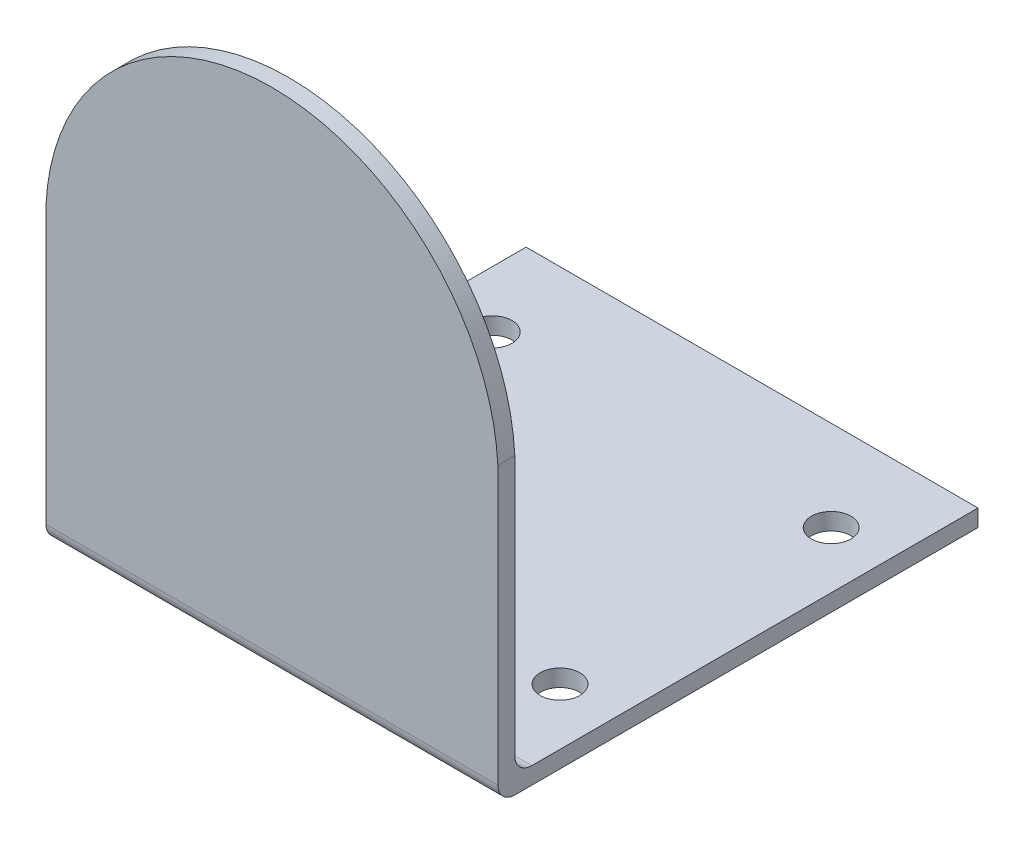
ISO-10303-21;
HEADER;
FILE_DESCRIPTION(('STEP AP214'),'2;1');
FILE_NAME('part.step','',(''),(''),'','','');
FILE_SCHEMA(('AUTOMOTIVE_DESIGN { 1 0 10303 214 1 1 1 1 }'));
ENDSEC;
DATA;
#1=APPLICATION_CONTEXT('core data for automotive mechanical design processes');
#2=APPLICATION_PROTOCOL_DEFINITION('international standard','automotive_design',2000,#1);
#3=PRODUCT_CONTEXT('',#1,'mechanical');
#4=PRODUCT('Part','Part','',(#3));
#5=PRODUCT_RELATED_PRODUCT_CATEGORY('part','',(#4));
#6=PRODUCT_DEFINITION_FORMATION('','',#4);
#7=PRODUCT_DEFINITION_CONTEXT('part definition',#1,'design');
#8=PRODUCT_DEFINITION('design','',#6,#7);
#9=PRODUCT_DEFINITION_SHAPE('','',#8);
#10=(LENGTH_UNIT() NAMED_UNIT(*) SI_UNIT(.MILLI.,.METRE.));
#11=(NAMED_UNIT(*) PLANE_ANGLE_UNIT() SI_UNIT($,.RADIAN.));
#12=(NAMED_UNIT(*) SI_UNIT($,.STERADIAN.) SOLID_ANGLE_UNIT());
#13=UNCERTAINTY_MEASURE_WITH_UNIT(LENGTH_MEASURE(1.E-05),#10,'distance_accuracy_value','');
#14=(GEOMETRIC_REPRESENTATION_CONTEXT(3) GLOBAL_UNCERTAINTY_ASSIGNED_CONTEXT((#13)) GLOBAL_UNIT_ASSIGNED_CONTEXT((#10,
#11,#12)) REPRESENTATION_CONTEXT('',''));
#15=CARTESIAN_POINT('',(0.,0.,0.));
#16=DIRECTION('',(0.,0.,1.));
#17=DIRECTION('',(1.,0.,0.));
#18=AXIS2_PLACEMENT_3D('',#15,#16,#17);
#19=CARTESIAN_POINT('',(0.,1.5,0.));
#20=DIRECTION('',(0.,1.,0.));
#21=DIRECTION('',(0.,0.,1.));
#22=AXIS2_PLACEMENT_3D('',#19,#20,#21);
#23=PLANE('',#22);
#24=CARTESIAN_POINT('',(13.5904436860068,1.5,-9.41126279863477));
#25=DIRECTION('',(0.,1.,0.));
#26=DIRECTION('',(0.,0.,1.));
#27=AXIS2_PLACEMENT_3D('',#24,#25,#26);
#28=CIRCLE('',#27,1.75);
#29=CARTESIAN_POINT('',(13.5904436860068,1.5,-7.66126279863477));
#30=VERTEX_POINT('',#29);
#31=EDGE_CURVE('E139',#30,#30,#28,.T.);
#32=ORIENTED_EDGE('',*,*,#31,.F.);
#33=EDGE_LOOP('',(#32));
#34=FACE_BOUND('',#33,.T.);
#35=CARTESIAN_POINT('',(-16.4095563139932,1.5,-9.41126279863477));
#36=DIRECTION('',(0.,1.,0.));
#37=DIRECTION('',(0.,0.,1.));
#38=AXIS2_PLACEMENT_3D('',#35,#36,#37);
#39=CIRCLE('',#38,1.75);
#40=CARTESIAN_POINT('',(-16.4095563139932,1.5,-7.66126279863477));
#41=VERTEX_POINT('',#40);
#42=EDGE_CURVE('E151',#41,#41,#39,.T.);
#43=ORIENTED_EDGE('',*,*,#42,.F.);
#44=EDGE_LOOP('',(#43));
#45=FACE_BOUND('',#44,.T.);
#46=DIRECTION('',(0.,0.,1.));
#47=VECTOR('',#46,1.);
#48=CARTESIAN_POINT('',(-21.4095563139932,1.5,-17.4112627986348));
#49=LINE('',#48,#47);
#50=CARTESIAN_POINT('',(-21.4095563139932,1.5,-17.4112627986348));
#51=VERTEX_POINT('',#50);
#52=CARTESIAN_POINT('',(-21.4095563139932,1.5,22.0887372013652));
#53=VERTEX_POINT('',#52);
#54=EDGE_CURVE('E157',#51,#53,#49,.T.);
#55=ORIENTED_EDGE('',*,*,#54,.T.);
#56=DIRECTION('',(1.,0.,0.));
#57=VECTOR('',#56,1.);
#58=CARTESIAN_POINT('',(18.5904436860068,1.5,22.0887372013652));
#59=LINE('',#58,#57);
#60=CARTESIAN_POINT('',(18.5904436860068,1.5,22.0887372013652));
#61=VERTEX_POINT('',#60);
#62=EDGE_CURVE('E182',#53,#61,#59,.T.);
#63=ORIENTED_EDGE('',*,*,#62,.T.);
#64=DIRECTION('',(0.,0.,-1.));
#65=VECTOR('',#64,1.);
#66=CARTESIAN_POINT('',(18.5904436860068,1.5,-17.4112627986348));
#67=LINE('',#66,#65);
#68=CARTESIAN_POINT('',(18.5904436860068,1.5,-17.4112627986348));
#69=VERTEX_POINT('',#68);
#70=EDGE_CURVE('E159',#61,#69,#67,.T.);
#71=ORIENTED_EDGE('',*,*,#70,.T.);
#72=DIRECTION('',(-1.,0.,0.));
#73=VECTOR('',#72,1.);
#74=CARTESIAN_POINT('',(-21.4095563139932,1.5,-17.4112627986348));
#75=LINE('',#74,#73);
#76=EDGE_CURVE('E162',#69,#51,#75,.T.);
#77=ORIENTED_EDGE('',*,*,#76,.T.);
#78=EDGE_LOOP('',(#55,#63,#71,#77));
#79=FACE_BOUND('',#78,.T.);
#80=CARTESIAN_POINT('',(-16.4095563139932,1.5,14.5887372013652));
#81=DIRECTION('',(0.,1.,0.));
#82=DIRECTION('',(0.,0.,1.));
#83=AXIS2_PLACEMENT_3D('',#80,#81,#82);
#84=CIRCLE('',#83,1.75);
#85=CARTESIAN_POINT('',(-16.4095563139932,1.5,16.3387372013652));
#86=VERTEX_POINT('',#85);
#87=EDGE_CURVE('E145',#86,#86,#84,.T.);
#88=ORIENTED_EDGE('',*,*,#87,.F.);
#89=EDGE_LOOP('',(#88));
#90=FACE_BOUND('',#89,.T.);
#91=CARTESIAN_POINT('',(13.5904436860068,1.5,14.5887372013652));
#92=DIRECTION('',(0.,1.,0.));
#93=DIRECTION('',(0.,0.,1.));
#94=AXIS2_PLACEMENT_3D('',#91,#92,#93);
#95=CIRCLE('',#94,1.75);
#96=CARTESIAN_POINT('',(13.5904436860068,1.5,16.3387372013652));
#97=VERTEX_POINT('',#96);
#98=EDGE_CURVE('E133',#97,#97,#95,.T.);
#99=ORIENTED_EDGE('',*,*,#98,.F.);
#100=EDGE_LOOP('',(#99));
#101=FACE_BOUND('',#100,.T.);
#102=ADVANCED_FACE('F34',(#34,#45,#79,#90,#101),#23,.T.);
#103=CARTESIAN_POINT('',(0.,0.,0.));
#104=DIRECTION('',(0.,1.,0.));
#105=DIRECTION('',(0.,0.,1.));
#106=AXIS2_PLACEMENT_3D('',#103,#104,#105);
#107=PLANE('',#106);
#108=DIRECTION('',(0.,0.,-1.));
#109=VECTOR('',#108,1.);
#110=CARTESIAN_POINT('',(18.5904436860068,0.,-17.4112627986348));
#111=LINE('',#110,#109);
#112=CARTESIAN_POINT('',(18.5904436860068,0.,23.5887372013652));
#113=VERTEX_POINT('',#112);
#114=CARTESIAN_POINT('',(18.5904436860068,0.,-17.4112627986348));
#115=VERTEX_POINT('',#114);
#116=EDGE_CURVE('E167',#113,#115,#111,.T.);
#117=ORIENTED_EDGE('',*,*,#116,.F.);
#118=DIRECTION('',(1.,0.,0.));
#119=VECTOR('',#118,1.);
#120=CARTESIAN_POINT('',(0.,0.,23.5887372013652));
#121=LINE('',#120,#119);
#122=CARTESIAN_POINT('',(-21.4095563139932,0.,23.5887372013652));
#123=VERTEX_POINT('',#122);
#124=EDGE_CURVE('E178',#113,#123,#121,.F.);
#125=ORIENTED_EDGE('',*,*,#124,.T.);
#126=DIRECTION('',(0.,0.,1.));
#127=VECTOR('',#126,1.);
#128=CARTESIAN_POINT('',(-21.4095563139932,0.,-17.4112627986348));
#129=LINE('',#128,#127);
#130=CARTESIAN_POINT('',(-21.4095563139932,0.,-17.4112627986348));
#131=VERTEX_POINT('',#130);
#132=EDGE_CURVE('E154',#131,#123,#129,.T.);
#133=ORIENTED_EDGE('',*,*,#132,.F.);
#134=DIRECTION('',(-1.,0.,0.));
#135=VECTOR('',#134,1.);
#136=CARTESIAN_POINT('',(-21.4095563139932,0.,-17.4112627986348));
#137=LINE('',#136,#135);
#138=EDGE_CURVE('E160',#115,#131,#137,.T.);
#139=ORIENTED_EDGE('',*,*,#138,.F.);
#140=EDGE_LOOP('',(#117,#125,#133,#139));
#141=FACE_BOUND('',#140,.T.);
#142=CARTESIAN_POINT('',(-16.4095563139932,0.,-9.41126279863477));
#143=DIRECTION('',(0.,1.,0.));
#144=DIRECTION('',(0.,0.,1.));
#145=AXIS2_PLACEMENT_3D('',#142,#143,#144);
#146=CIRCLE('',#145,1.75);
#147=CARTESIAN_POINT('',(-16.4095563139932,0.,-7.66126279863477));
#148=VERTEX_POINT('',#147);
#149=EDGE_CURVE('E148',#148,#148,#146,.T.);
#150=ORIENTED_EDGE('',*,*,#149,.T.);
#151=EDGE_LOOP('',(#150));
#152=FACE_BOUND('',#151,.T.);
#153=CARTESIAN_POINT('',(-16.4095563139932,0.,14.5887372013652));
#154=DIRECTION('',(0.,1.,0.));
#155=DIRECTION('',(0.,0.,1.));
#156=AXIS2_PLACEMENT_3D('',#153,#154,#155);
#157=CIRCLE('',#156,1.75);
#158=CARTESIAN_POINT('',(-16.4095563139932,0.,16.3387372013652));
#159=VERTEX_POINT('',#158);
#160=EDGE_CURVE('E142',#159,#159,#157,.T.);
#161=ORIENTED_EDGE('',*,*,#160,.T.);
#162=EDGE_LOOP('',(#161));
#163=FACE_BOUND('',#162,.T.);
#164=CARTESIAN_POINT('',(13.5904436860068,0.,-9.41126279863477));
#165=DIRECTION('',(0.,1.,0.));
#166=DIRECTION('',(0.,0.,1.));
#167=AXIS2_PLACEMENT_3D('',#164,#165,#166);
#168=CIRCLE('',#167,1.75);
#169=CARTESIAN_POINT('',(13.5904436860068,0.,-7.66126279863477));
#170=VERTEX_POINT('',#169);
#171=EDGE_CURVE('E136',#170,#170,#168,.T.);
#172=ORIENTED_EDGE('',*,*,#171,.T.);
#173=EDGE_LOOP('',(#172));
#174=FACE_BOUND('',#173,.T.);
#175=CARTESIAN_POINT('',(13.5904436860068,0.,14.5887372013652));
#176=DIRECTION('',(0.,1.,0.));
#177=DIRECTION('',(0.,0.,1.));
#178=AXIS2_PLACEMENT_3D('',#175,#176,#177);
#179=CIRCLE('',#178,1.75);
#180=CARTESIAN_POINT('',(13.5904436860068,0.,16.3387372013652));
#181=VERTEX_POINT('',#180);
#182=EDGE_CURVE('E119',#181,#181,#179,.T.);
#183=ORIENTED_EDGE('',*,*,#182,.T.);
#184=EDGE_LOOP('',(#183));
#185=FACE_BOUND('',#184,.T.);
#186=ADVANCED_FACE('F201',(#141,#152,#163,#174,#185),#107,.F.);
#187=CARTESIAN_POINT('',(-21.4095563139932,1.5,-17.4112627986348));
#188=DIRECTION('',(1.,0.,0.));
#189=DIRECTION('',(0.,0.,-1.));
#190=AXIS2_PLACEMENT_3D('',#187,#188,#189);
#191=PLANE('',#190);
#192=ORIENTED_EDGE('',*,*,#132,.T.);
#193=CARTESIAN_POINT('',(-21.4095563139932,1.5,23.5887372013652));
#194=DIRECTION('',(1.,0.,0.));
#195=DIRECTION('',(0.,0.,-1.));
#196=AXIS2_PLACEMENT_3D('',#193,#194,#195);
#197=CIRCLE('',#196,1.5);
#198=CARTESIAN_POINT('',(-21.4095563139932,1.5,25.0887372013652));
#199=VERTEX_POINT('',#198);
#200=EDGE_CURVE('E180',#123,#199,#197,.F.);
#201=ORIENTED_EDGE('',*,*,#200,.T.);
#202=DIRECTION('',(0.,-1.,0.));
#203=VECTOR('',#202,1.);
#204=CARTESIAN_POINT('',(-21.4095563139932,1.5,25.0887372013652));
#205=LINE('',#204,#203);
#206=CARTESIAN_POINT('',(-21.4095563139932,26.0233331601843,25.0887372013652));
#207=VERTEX_POINT('',#206);
#208=EDGE_CURVE('E111',#207,#199,#205,.T.);
#209=ORIENTED_EDGE('',*,*,#208,.F.);
#210=DIRECTION('',(0.,0.,-1.));
#211=VECTOR('',#210,1.);
#212=CARTESIAN_POINT('',(-21.4095563139932,26.0233331601843,25.0887372013652));
#213=LINE('',#212,#211);
#214=CARTESIAN_POINT('',(-21.4095563139932,26.0233331601843,23.5887372013652));
#215=VERTEX_POINT('',#214);
#216=EDGE_CURVE('E120',#207,#215,#213,.T.);
#217=ORIENTED_EDGE('',*,*,#216,.T.);
#218=DIRECTION('',(0.,-1.,0.));
#219=VECTOR('',#218,1.);
#220=CARTESIAN_POINT('',(-21.4095563139932,1.5,23.5887372013652));
#221=LINE('',#220,#219);
#222=CARTESIAN_POINT('',(-21.4095563139932,3.,23.5887372013652));
#223=VERTEX_POINT('',#222);
#224=EDGE_CURVE('E131',#215,#223,#221,.T.);
#225=ORIENTED_EDGE('',*,*,#224,.T.);
#226=CARTESIAN_POINT('',(-21.4095563139932,3.,22.0887372013652));
#227=DIRECTION('',(1.,0.,0.));
#228=DIRECTION('',(0.,0.,-1.));
#229=AXIS2_PLACEMENT_3D('',#226,#227,#228);
#230=CIRCLE('',#229,1.5);
#231=EDGE_CURVE('E11',#223,#53,#230,.T.);
#232=ORIENTED_EDGE('',*,*,#231,.T.);
#233=ORIENTED_EDGE('',*,*,#54,.F.);
#234=DIRECTION('',(0.,-1.,0.));
#235=VECTOR('',#234,1.);
#236=CARTESIAN_POINT('',(-21.4095563139932,1.5,-17.4112627986348));
#237=LINE('',#236,#235);
#238=EDGE_CURVE('E164',#51,#131,#237,.T.);
#239=ORIENTED_EDGE('',*,*,#238,.T.);
#240=EDGE_LOOP('',(#192,#201,#209,#217,#225,#232,#233,#239));
#241=FACE_BOUND('',#240,.T.);
#242=ADVANCED_FACE('F194',(#241),#191,.F.);
#243=CARTESIAN_POINT('',(18.5904436860068,1.5,-17.4112627986348));
#244=DIRECTION('',(-1.,0.,0.));
#245=DIRECTION('',(0.,0.,1.));
#246=AXIS2_PLACEMENT_3D('',#243,#244,#245);
#247=PLANE('',#246);
#248=DIRECTION('',(0.,1.,0.));
#249=VECTOR('',#248,1.);
#250=CARTESIAN_POINT('',(18.5904436860068,1.5,25.0887372013652));
#251=LINE('',#250,#249);
#252=CARTESIAN_POINT('',(18.5904436860068,1.5,25.0887372013652));
#253=VERTEX_POINT('',#252);
#254=CARTESIAN_POINT('',(18.5904436860068,26.0233331601844,25.0887372013652));
#255=VERTEX_POINT('',#254);
#256=EDGE_CURVE('E101',#253,#255,#251,.T.);
#257=ORIENTED_EDGE('',*,*,#256,.F.);
#258=CARTESIAN_POINT('',(18.5904436860068,1.5,23.5887372013652));
#259=DIRECTION('',(-1.,0.,0.));
#260=DIRECTION('',(0.,0.,1.));
#261=AXIS2_PLACEMENT_3D('',#258,#259,#260);
#262=CIRCLE('',#261,1.5);
#263=EDGE_CURVE('E176',#253,#113,#262,.F.);
#264=ORIENTED_EDGE('',*,*,#263,.T.);
#265=ORIENTED_EDGE('',*,*,#116,.T.);
#266=DIRECTION('',(0.,-1.,0.));
#267=VECTOR('',#266,1.);
#268=CARTESIAN_POINT('',(18.5904436860068,1.5,-17.4112627986348));
#269=LINE('',#268,#267);
#270=EDGE_CURVE('E172',#69,#115,#269,.T.);
#271=ORIENTED_EDGE('',*,*,#270,.F.);
#272=ORIENTED_EDGE('',*,*,#70,.F.);
#273=CARTESIAN_POINT('',(18.5904436860068,3.,22.0887372013652));
#274=DIRECTION('',(-1.,0.,0.));
#275=DIRECTION('',(0.,0.,1.));
#276=AXIS2_PLACEMENT_3D('',#273,#274,#275);
#277=CIRCLE('',#276,1.5);
#278=CARTESIAN_POINT('',(18.5904436860068,3.,23.5887372013652));
#279=VERTEX_POINT('',#278);
#280=EDGE_CURVE('E42',#61,#279,#277,.T.);
#281=ORIENTED_EDGE('',*,*,#280,.T.);
#282=DIRECTION('',(0.,1.,0.));
#283=VECTOR('',#282,1.);
#284=CARTESIAN_POINT('',(18.5904436860068,1.5,23.5887372013652));
#285=LINE('',#284,#283);
#286=CARTESIAN_POINT('',(18.5904436860068,26.0233331601844,23.5887372013652));
#287=VERTEX_POINT('',#286);
#288=EDGE_CURVE('E116',#279,#287,#285,.T.);
#289=ORIENTED_EDGE('',*,*,#288,.T.);
#290=DIRECTION('',(0.,0.,-1.));
#291=VECTOR('',#290,1.);
#292=CARTESIAN_POINT('',(18.5904436860068,26.0233331601844,25.0887372013652));
#293=LINE('',#292,#291);
#294=EDGE_CURVE('E114',#255,#287,#293,.T.);
#295=ORIENTED_EDGE('',*,*,#294,.F.);
#296=EDGE_LOOP('',(#257,#264,#265,#271,#272,#281,#289,#295));
#297=FACE_BOUND('',#296,.T.);
#298=ADVANCED_FACE('F115',(#297),#247,.F.);
#299=CARTESIAN_POINT('',(-21.4095563139932,1.5,-17.4112627986348));
#300=DIRECTION('',(0.,0.,1.));
#301=DIRECTION('',(1.,0.,0.));
#302=AXIS2_PLACEMENT_3D('',#299,#300,#301);
#303=PLANE('',#302);
#304=ORIENTED_EDGE('',*,*,#138,.T.);
#305=ORIENTED_EDGE('',*,*,#238,.F.);
#306=ORIENTED_EDGE('',*,*,#76,.F.);
#307=ORIENTED_EDGE('',*,*,#270,.T.);
#308=EDGE_LOOP('',(#304,#305,#306,#307));
#309=FACE_BOUND('',#308,.T.);
#310=ADVANCED_FACE('F206',(#309),#303,.F.);
#311=CARTESIAN_POINT('',(-16.4095563139932,1.5,-9.41126279863477));
#312=DIRECTION('',(0.,-1.,0.));
#313=DIRECTION('',(0.,0.,-1.));
#314=AXIS2_PLACEMENT_3D('',#311,#312,#313);
#315=CYLINDRICAL_SURFACE('',#314,1.75);
#316=ORIENTED_EDGE('',*,*,#42,.T.);
#317=EDGE_LOOP('',(#316));
#318=FACE_BOUND('',#317,.T.);
#319=ORIENTED_EDGE('',*,*,#149,.F.);
#320=EDGE_LOOP('',(#319));
#321=FACE_BOUND('',#320,.T.);
#322=ADVANCED_FACE('F208',(#318,#321),#315,.F.);
#323=CARTESIAN_POINT('',(-16.4095563139932,1.5,14.5887372013652));
#324=DIRECTION('',(0.,-1.,0.));
#325=DIRECTION('',(0.,0.,-1.));
#326=AXIS2_PLACEMENT_3D('',#323,#324,#325);
#327=CYLINDRICAL_SURFACE('',#326,1.75);
#328=ORIENTED_EDGE('',*,*,#87,.T.);
#329=EDGE_LOOP('',(#328));
#330=FACE_BOUND('',#329,.T.);
#331=ORIENTED_EDGE('',*,*,#160,.F.);
#332=EDGE_LOOP('',(#331));
#333=FACE_BOUND('',#332,.T.);
#334=ADVANCED_FACE('F214',(#330,#333),#327,.F.);
#335=CARTESIAN_POINT('',(13.5904436860068,1.5,-9.41126279863477));
#336=DIRECTION('',(0.,-1.,0.));
#337=DIRECTION('',(0.,0.,-1.));
#338=AXIS2_PLACEMENT_3D('',#335,#336,#337);
#339=CYLINDRICAL_SURFACE('',#338,1.75);
#340=ORIENTED_EDGE('',*,*,#31,.T.);
#341=EDGE_LOOP('',(#340));
#342=FACE_BOUND('',#341,.T.);
#343=ORIENTED_EDGE('',*,*,#171,.F.);
#344=EDGE_LOOP('',(#343));
#345=FACE_BOUND('',#344,.T.);
#346=ADVANCED_FACE('F230',(#342,#345),#339,.F.);
#347=CARTESIAN_POINT('',(13.5904436860068,1.5,14.5887372013652));
#348=DIRECTION('',(0.,-1.,0.));
#349=DIRECTION('',(0.,0.,-1.));
#350=AXIS2_PLACEMENT_3D('',#347,#348,#349);
#351=CYLINDRICAL_SURFACE('',#350,1.75);
#352=ORIENTED_EDGE('',*,*,#98,.T.);
#353=EDGE_LOOP('',(#352));
#354=FACE_BOUND('',#353,.T.);
#355=ORIENTED_EDGE('',*,*,#182,.F.);
#356=EDGE_LOOP('',(#355));
#357=FACE_BOUND('',#356,.T.);
#358=ADVANCED_FACE('F234',(#354,#357),#351,.F.);
#359=CARTESIAN_POINT('',(-1.40955631399319,24.9724079374536,23.5887372013652));
#360=DIRECTION('',(0.,0.,-1.));
#361=DIRECTION('',(-1.,0.,0.));
#362=AXIS2_PLACEMENT_3D('',#359,#360,#361);
#363=PLANE('',#362);
#364=ORIENTED_EDGE('',*,*,#288,.F.);
#365=DIRECTION('',(1.,0.,0.));
#366=VECTOR('',#365,1.);
#367=CARTESIAN_POINT('',(-21.4095563139932,3.,23.5887372013652));
#368=LINE('',#367,#366);
#369=EDGE_CURVE('E55',#279,#223,#368,.F.);
#370=ORIENTED_EDGE('',*,*,#369,.T.);
#371=ORIENTED_EDGE('',*,*,#224,.F.);
#372=CARTESIAN_POINT('',(-1.40955631399319,24.9724079374536,23.5887372013652));
#373=DIRECTION('',(0.,0.,1.));
#374=DIRECTION('',(-1.,0.,0.));
#375=AXIS2_PLACEMENT_3D('',#372,#373,#374);
#376=CIRCLE('',#375,20.0275920625464);
#377=EDGE_CURVE('E129',#287,#215,#376,.T.);
#378=ORIENTED_EDGE('',*,*,#377,.F.);
#379=EDGE_LOOP('',(#364,#370,#371,#378));
#380=FACE_BOUND('',#379,.T.);
#381=ADVANCED_FACE('F189',(#380),#363,.T.);
#382=CARTESIAN_POINT('',(-1.40955631399319,24.9724079374536,25.0887372013652));
#383=DIRECTION('',(0.,0.,-1.));
#384=DIRECTION('',(-1.,0.,0.));
#385=AXIS2_PLACEMENT_3D('',#382,#383,#384);
#386=CYLINDRICAL_SURFACE('',#385,20.0275920625464);
#387=ORIENTED_EDGE('',*,*,#377,.T.);
#388=ORIENTED_EDGE('',*,*,#216,.F.);
#389=CARTESIAN_POINT('',(-1.40955631399319,24.9724079374536,25.0887372013652));
#390=DIRECTION('',(0.,0.,1.));
#391=DIRECTION('',(-1.,0.,0.));
#392=AXIS2_PLACEMENT_3D('',#389,#390,#391);
#393=CIRCLE('',#392,20.0275920625464);
#394=EDGE_CURVE('E106',#255,#207,#393,.T.);
#395=ORIENTED_EDGE('',*,*,#394,.F.);
#396=ORIENTED_EDGE('',*,*,#294,.T.);
#397=EDGE_LOOP('',(#387,#388,#395,#396));
#398=FACE_BOUND('',#397,.T.);
#399=ADVANCED_FACE('F122',(#398),#386,.T.);
#400=CARTESIAN_POINT('',(-1.40955631399319,24.9724079374536,25.0887372013652));
#401=DIRECTION('',(0.,0.,-1.));
#402=DIRECTION('',(-1.,0.,0.));
#403=AXIS2_PLACEMENT_3D('',#400,#401,#402);
#404=PLANE('',#403);
#405=ORIENTED_EDGE('',*,*,#208,.T.);
#406=DIRECTION('',(1.,0.,0.));
#407=VECTOR('',#406,1.);
#408=CARTESIAN_POINT('',(-1.40955631399319,1.5,25.0887372013652));
#409=LINE('',#408,#407);
#410=EDGE_CURVE('E109',#199,#253,#409,.T.);
#411=ORIENTED_EDGE('',*,*,#410,.T.);
#412=ORIENTED_EDGE('',*,*,#256,.T.);
#413=ORIENTED_EDGE('',*,*,#394,.T.);
#414=EDGE_LOOP('',(#405,#411,#412,#413));
#415=FACE_BOUND('',#414,.T.);
#416=ADVANCED_FACE('F104',(#415),#404,.F.);
#417=CARTESIAN_POINT('',(-1.40955631399319,1.5,23.5887372013652));
#418=DIRECTION('',(1.,0.,0.));
#419=DIRECTION('',(0.,0.,-1.));
#420=AXIS2_PLACEMENT_3D('',#417,#418,#419);
#421=CYLINDRICAL_SURFACE('',#420,1.5);
#422=ORIENTED_EDGE('',*,*,#200,.F.);
#423=ORIENTED_EDGE('',*,*,#124,.F.);
#424=ORIENTED_EDGE('',*,*,#263,.F.);
#425=ORIENTED_EDGE('',*,*,#410,.F.);
#426=EDGE_LOOP('',(#422,#423,#424,#425));
#427=FACE_BOUND('',#426,.T.);
#428=ADVANCED_FACE('F205',(#427),#421,.T.);
#429=CARTESIAN_POINT('',(0.,3.,22.0887372013652));
#430=DIRECTION('',(-1.,0.,0.));
#431=DIRECTION('',(0.,0.,1.));
#432=AXIS2_PLACEMENT_3D('',#429,#430,#431);
#433=CYLINDRICAL_SURFACE('',#432,1.5);
#434=ORIENTED_EDGE('',*,*,#231,.F.);
#435=ORIENTED_EDGE('',*,*,#369,.F.);
#436=ORIENTED_EDGE('',*,*,#280,.F.);
#437=ORIENTED_EDGE('',*,*,#62,.F.);
#438=EDGE_LOOP('',(#434,#435,#436,#437));
#439=FACE_BOUND('',#438,.T.);
#440=ADVANCED_FACE('F36',(#439),#433,.F.);
#441=CLOSED_SHELL('',(#102,#186,#242,#298,#310,#322,#334,#346,#358,#381,#399,#416,#428,#440));
#442=MANIFOLD_SOLID_BREP('B2',#441);
#443=ADVANCED_BREP_SHAPE_REPRESENTATION('',(#18,#442),#14);
#444=SHAPE_DEFINITION_REPRESENTATION(#9,#443);
ENDSEC;
END-ISO-10303-21;
